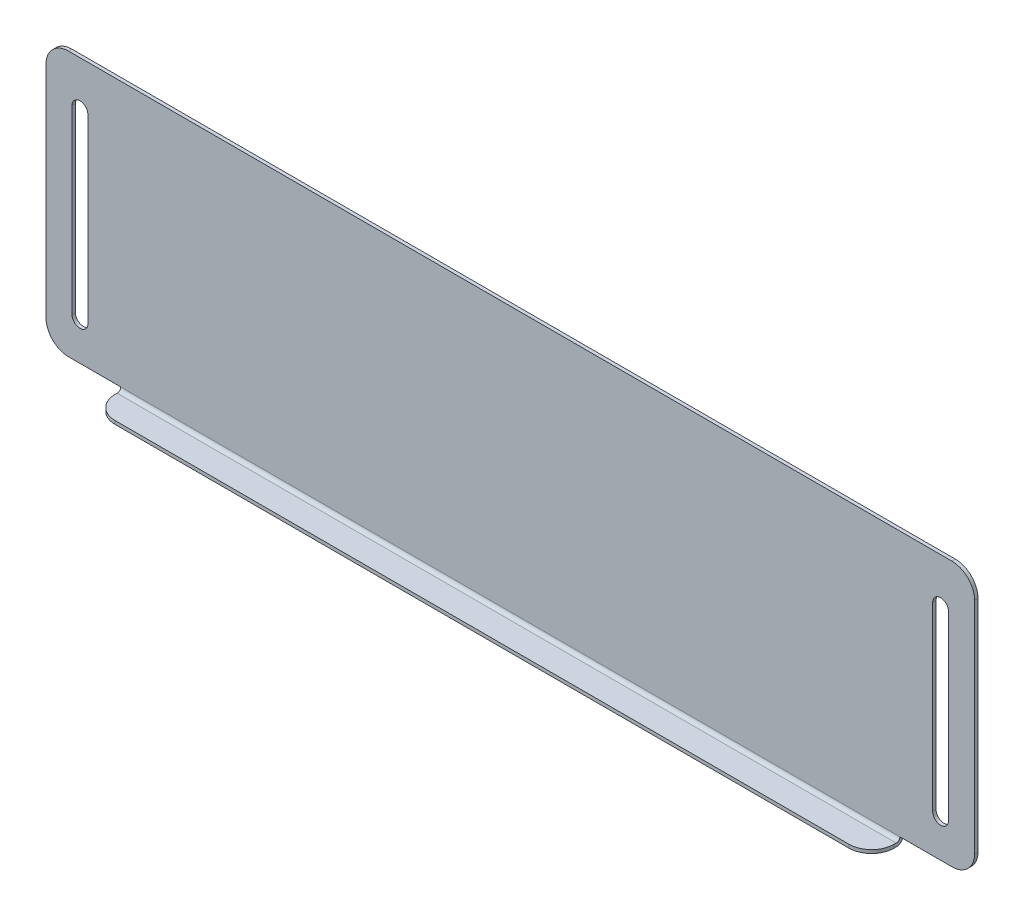
ISO-10303-21;
HEADER;
FILE_DESCRIPTION(('STEP AP214'),'2;1');
FILE_NAME('part.step','',(''),(''),'','','');
FILE_SCHEMA(('AUTOMOTIVE_DESIGN { 1 0 10303 214 1 1 1 1 }'));
ENDSEC;
DATA;
#1=APPLICATION_CONTEXT('core data for automotive mechanical design processes');
#2=APPLICATION_PROTOCOL_DEFINITION('international standard','automotive_design',2000,#1);
#3=PRODUCT_CONTEXT('',#1,'mechanical');
#4=PRODUCT('Part','Part','',(#3));
#5=PRODUCT_RELATED_PRODUCT_CATEGORY('part','',(#4));
#6=PRODUCT_DEFINITION_FORMATION('','',#4);
#7=PRODUCT_DEFINITION_CONTEXT('part definition',#1,'design');
#8=PRODUCT_DEFINITION('design','',#6,#7);
#9=PRODUCT_DEFINITION_SHAPE('','',#8);
#10=(LENGTH_UNIT() NAMED_UNIT(*) SI_UNIT(.MILLI.,.METRE.));
#11=(NAMED_UNIT(*) PLANE_ANGLE_UNIT() SI_UNIT($,.RADIAN.));
#12=(NAMED_UNIT(*) SI_UNIT($,.STERADIAN.) SOLID_ANGLE_UNIT());
#13=UNCERTAINTY_MEASURE_WITH_UNIT(LENGTH_MEASURE(1.E-05),#10,'distance_accuracy_value','');
#14=(GEOMETRIC_REPRESENTATION_CONTEXT(3) GLOBAL_UNCERTAINTY_ASSIGNED_CONTEXT((#13)) GLOBAL_UNIT_ASSIGNED_CONTEXT((#10,
#11,#12)) REPRESENTATION_CONTEXT('',''));
#15=CARTESIAN_POINT('',(0.,0.,0.));
#16=DIRECTION('',(0.,0.,1.));
#17=DIRECTION('',(1.,0.,0.));
#18=AXIS2_PLACEMENT_3D('',#15,#16,#17);
#19=CARTESIAN_POINT('',(-172.,-56.9,-1.50000000000041));
#20=DIRECTION('',(-1.,0.,0.));
#21=DIRECTION('',(0.,0.,1.));
#22=AXIS2_PLACEMENT_3D('',#19,#20,#21);
#23=PLANE('',#22);
#24=DIRECTION('',(0.,0.,-1.));
#25=VECTOR('',#24,1.);
#26=CARTESIAN_POINT('',(-172.,-60.,-1.50000000000043));
#27=LINE('',#26,#25);
#28=CARTESIAN_POINT('',(-172.,-60.,2.5));
#29=VERTEX_POINT('',#28);
#30=CARTESIAN_POINT('',(-172.,-60.,1.59999999999998));
#31=VERTEX_POINT('',#30);
#32=EDGE_CURVE('E304',#29,#31,#27,.T.);
#33=ORIENTED_EDGE('',*,*,#32,.F.);
#34=DIRECTION('',(0.,1.,0.));
#35=VECTOR('',#34,1.);
#36=CARTESIAN_POINT('',(-172.,-58.5,2.50000000000001));
#37=LINE('',#36,#35);
#38=CARTESIAN_POINT('',(-172.,-58.5,2.50000000000001));
#39=VERTEX_POINT('',#38);
#40=EDGE_CURVE('E361',#29,#39,#37,.T.);
#41=ORIENTED_EDGE('',*,*,#40,.T.);
#42=DIRECTION('',(0.,0.,1.));
#43=VECTOR('',#42,1.);
#44=CARTESIAN_POINT('',(-172.,-58.5,-1.99840144432528E-13));
#45=LINE('',#44,#43);
#46=CARTESIAN_POINT('',(-172.,-58.5,1.59999999999998));
#47=VERTEX_POINT('',#46);
#48=EDGE_CURVE('E311',#47,#39,#45,.T.);
#49=ORIENTED_EDGE('',*,*,#48,.F.);
#50=DIRECTION('',(0.,-1.,0.));
#51=VECTOR('',#50,1.);
#52=CARTESIAN_POINT('',(-172.,-58.5,1.59999999999998));
#53=LINE('',#52,#51);
#54=EDGE_CURVE('E351',#47,#31,#53,.T.);
#55=ORIENTED_EDGE('',*,*,#54,.T.);
#56=EDGE_LOOP('',(#33,#41,#49,#55));
#57=FACE_BOUND('',#56,.T.);
#58=ADVANCED_FACE('F62',(#57),#23,.T.);
#59=CARTESIAN_POINT('',(205.,-56.9,1.6));
#60=DIRECTION('',(1.,0.,0.));
#61=DIRECTION('',(0.,-1.,0.));
#62=AXIS2_PLACEMENT_3D('',#59,#60,#61);
#63=CYLINDRICAL_SURFACE('',#62,3.1);
#64=DIRECTION('',(1.,0.,0.));
#65=VECTOR('',#64,1.);
#66=CARTESIAN_POINT('',(205.,-56.9,-1.5));
#67=LINE('',#66,#65);
#68=CARTESIAN_POINT('',(172.,-56.9,-1.50000000000046));
#69=VERTEX_POINT('',#68);
#70=CARTESIAN_POINT('',(-172.,-56.9,-1.50000000000041));
#71=VERTEX_POINT('',#70);
#72=EDGE_CURVE('E337',#69,#71,#67,.F.);
#73=ORIENTED_EDGE('',*,*,#72,.F.);
#74=CARTESIAN_POINT('',(172.,-56.9,1.6));
#75=DIRECTION('',(1.,0.,0.));
#76=DIRECTION('',(0.,0.,-1.));
#77=AXIS2_PLACEMENT_3D('',#74,#75,#76);
#78=CIRCLE('',#77,3.1);
#79=CARTESIAN_POINT('',(172.,-60.,1.59999999999998));
#80=VERTEX_POINT('',#79);
#81=EDGE_CURVE('E301',#69,#80,#78,.F.);
#82=ORIENTED_EDGE('',*,*,#81,.T.);
#83=DIRECTION('',(1.,0.,0.));
#84=VECTOR('',#83,1.);
#85=CARTESIAN_POINT('',(-205.,-60.,1.59999999999999));
#86=LINE('',#85,#84);
#87=EDGE_CURVE('E329',#80,#31,#86,.F.);
#88=ORIENTED_EDGE('',*,*,#87,.T.);
#89=CARTESIAN_POINT('',(-172.,-56.9,1.6));
#90=DIRECTION('',(-1.,0.,0.));
#91=DIRECTION('',(0.,0.,1.));
#92=AXIS2_PLACEMENT_3D('',#89,#90,#91);
#93=CIRCLE('',#92,3.1);
#94=EDGE_CURVE('E318',#31,#71,#93,.F.);
#95=ORIENTED_EDGE('',*,*,#94,.T.);
#96=EDGE_LOOP('',(#73,#82,#88,#95));
#97=FACE_BOUND('',#96,.T.);
#98=ADVANCED_FACE('F481',(#97),#63,.T.);
#99=CARTESIAN_POINT('',(205.,-56.9,1.6));
#100=DIRECTION('',(1.,0.,0.));
#101=DIRECTION('',(0.,-1.,0.));
#102=AXIS2_PLACEMENT_3D('',#99,#100,#101);
#103=CYLINDRICAL_SURFACE('',#102,1.6);
#104=CARTESIAN_POINT('',(172.,-56.9,1.6));
#105=DIRECTION('',(1.,0.,0.));
#106=DIRECTION('',(0.,0.,-1.));
#107=AXIS2_PLACEMENT_3D('',#104,#105,#106);
#108=CIRCLE('',#107,1.6);
#109=CARTESIAN_POINT('',(172.,-56.9,0.));
#110=VERTEX_POINT('',#109);
#111=CARTESIAN_POINT('',(172.,-58.5,1.59999999999998));
#112=VERTEX_POINT('',#111);
#113=EDGE_CURVE('E298',#110,#112,#108,.F.);
#114=ORIENTED_EDGE('',*,*,#113,.F.);
#115=DIRECTION('',(1.,0.,0.));
#116=VECTOR('',#115,1.);
#117=CARTESIAN_POINT('',(205.,-56.9,0.));
#118=LINE('',#117,#116);
#119=CARTESIAN_POINT('',(-172.,-56.9,0.));
#120=VERTEX_POINT('',#119);
#121=EDGE_CURVE('E340',#110,#120,#118,.F.);
#122=ORIENTED_EDGE('',*,*,#121,.T.);
#123=CARTESIAN_POINT('',(-172.,-56.9,1.6));
#124=DIRECTION('',(-1.,0.,0.));
#125=DIRECTION('',(0.,0.,1.));
#126=AXIS2_PLACEMENT_3D('',#123,#124,#125);
#127=CIRCLE('',#126,1.6);
#128=EDGE_CURVE('E315',#47,#120,#127,.F.);
#129=ORIENTED_EDGE('',*,*,#128,.F.);
#130=DIRECTION('',(1.,0.,0.));
#131=VECTOR('',#130,1.);
#132=CARTESIAN_POINT('',(-205.,-58.5,1.6));
#133=LINE('',#132,#131);
#134=EDGE_CURVE('E321',#47,#112,#133,.T.);
#135=ORIENTED_EDGE('',*,*,#134,.T.);
#136=EDGE_LOOP('',(#114,#122,#129,#135));
#137=FACE_BOUND('',#136,.T.);
#138=ADVANCED_FACE('F458',(#137),#103,.F.);
#139=CARTESIAN_POINT('',(0.,-60.,-2.05077366440793E-13));
#140=DIRECTION('',(0.,1.,0.));
#141=DIRECTION('',(0.,0.,1.));
#142=AXIS2_PLACEMENT_3D('',#139,#140,#141);
#143=PLANE('',#142);
#144=DIRECTION('',(-1.,0.,0.));
#145=VECTOR('',#144,1.);
#146=CARTESIAN_POINT('',(0.,-60.,12.5));
#147=LINE('',#146,#145);
#148=CARTESIAN_POINT('',(162.,-60.,12.5));
#149=VERTEX_POINT('',#148);
#150=CARTESIAN_POINT('',(-162.,-60.,12.5));
#151=VERTEX_POINT('',#150);
#152=EDGE_CURVE('E322',#149,#151,#147,.T.);
#153=ORIENTED_EDGE('',*,*,#152,.T.);
#154=CARTESIAN_POINT('',(-162.,-60.,2.5));
#155=DIRECTION('',(0.,1.,0.));
#156=DIRECTION('',(0.,0.,1.));
#157=AXIS2_PLACEMENT_3D('',#154,#155,#156);
#158=CIRCLE('',#157,10.);
#159=EDGE_CURVE('E374',#151,#29,#158,.F.);
#160=ORIENTED_EDGE('',*,*,#159,.T.);
#161=ORIENTED_EDGE('',*,*,#32,.T.);
#162=ORIENTED_EDGE('',*,*,#87,.F.);
#163=DIRECTION('',(0.,0.,1.));
#164=VECTOR('',#163,1.);
#165=CARTESIAN_POINT('',(172.,-60.,-1.50000000000047));
#166=LINE('',#165,#164);
#167=CARTESIAN_POINT('',(172.,-60.,2.5));
#168=VERTEX_POINT('',#167);
#169=EDGE_CURVE('E284',#80,#168,#166,.T.);
#170=ORIENTED_EDGE('',*,*,#169,.T.);
#171=CARTESIAN_POINT('',(162.,-60.,2.5));
#172=DIRECTION('',(0.,1.,0.));
#173=DIRECTION('',(0.,0.,1.));
#174=AXIS2_PLACEMENT_3D('',#171,#172,#173);
#175=CIRCLE('',#174,10.);
#176=EDGE_CURVE('E372',#168,#149,#175,.F.);
#177=ORIENTED_EDGE('',*,*,#176,.T.);
#178=EDGE_LOOP('',(#153,#160,#161,#162,#170,#177));
#179=FACE_BOUND('',#178,.T.);
#180=ADVANCED_FACE('F704',(#179),#143,.F.);
#181=CARTESIAN_POINT('',(0.,-58.5,-1.99840144432528E-13));
#182=DIRECTION('',(0.,1.,0.));
#183=DIRECTION('',(0.,0.,1.));
#184=AXIS2_PLACEMENT_3D('',#181,#182,#183);
#185=PLANE('',#184);
#186=ORIENTED_EDGE('',*,*,#48,.T.);
#187=CARTESIAN_POINT('',(-162.,-58.5,2.50000000000001));
#188=DIRECTION('',(0.,1.,0.));
#189=DIRECTION('',(0.,0.,1.));
#190=AXIS2_PLACEMENT_3D('',#187,#188,#189);
#191=CIRCLE('',#190,10.);
#192=CARTESIAN_POINT('',(-162.,-58.5,12.5));
#193=VERTEX_POINT('',#192);
#194=EDGE_CURVE('E366',#39,#193,#191,.T.);
#195=ORIENTED_EDGE('',*,*,#194,.T.);
#196=DIRECTION('',(1.,0.,0.));
#197=VECTOR('',#196,1.);
#198=CARTESIAN_POINT('',(-205.,-58.5,12.5));
#199=LINE('',#198,#197);
#200=CARTESIAN_POINT('',(162.,-58.5,12.5));
#201=VERTEX_POINT('',#200);
#202=EDGE_CURVE('E326',#201,#193,#199,.F.);
#203=ORIENTED_EDGE('',*,*,#202,.F.);
#204=CARTESIAN_POINT('',(162.,-58.5,2.5));
#205=DIRECTION('',(0.,1.,0.));
#206=DIRECTION('',(0.,0.,1.));
#207=AXIS2_PLACEMENT_3D('',#204,#205,#206);
#208=CIRCLE('',#207,10.);
#209=CARTESIAN_POINT('',(172.,-58.5,2.5));
#210=VERTEX_POINT('',#209);
#211=EDGE_CURVE('E364',#201,#210,#208,.T.);
#212=ORIENTED_EDGE('',*,*,#211,.T.);
#213=DIRECTION('',(0.,0.,-1.));
#214=VECTOR('',#213,1.);
#215=CARTESIAN_POINT('',(172.,-58.5,-1.99840144432528E-13));
#216=LINE('',#215,#214);
#217=EDGE_CURVE('E294',#210,#112,#216,.T.);
#218=ORIENTED_EDGE('',*,*,#217,.T.);
#219=ORIENTED_EDGE('',*,*,#134,.F.);
#220=EDGE_LOOP('',(#186,#195,#203,#212,#218,#219));
#221=FACE_BOUND('',#220,.T.);
#222=ADVANCED_FACE('F712',(#221),#185,.T.);
#223=CARTESIAN_POINT('',(-205.,-60.,12.5));
#224=DIRECTION('',(0.,0.,-1.));
#225=DIRECTION('',(0.,1.,0.));
#226=AXIS2_PLACEMENT_3D('',#223,#224,#225);
#227=PLANE('',#226);
#228=ORIENTED_EDGE('',*,*,#202,.T.);
#229=DIRECTION('',(0.,1.,0.));
#230=VECTOR('',#229,1.);
#231=CARTESIAN_POINT('',(-162.,-60.,12.5));
#232=LINE('',#231,#230);
#233=EDGE_CURVE('E370',#193,#151,#232,.F.);
#234=ORIENTED_EDGE('',*,*,#233,.T.);
#235=ORIENTED_EDGE('',*,*,#152,.F.);
#236=DIRECTION('',(0.,-1.,0.));
#237=VECTOR('',#236,1.);
#238=CARTESIAN_POINT('',(162.,-58.5,12.5));
#239=LINE('',#238,#237);
#240=EDGE_CURVE('E368',#149,#201,#239,.F.);
#241=ORIENTED_EDGE('',*,*,#240,.T.);
#242=EDGE_LOOP('',(#228,#234,#235,#241));
#243=FACE_BOUND('',#242,.T.);
#244=ADVANCED_FACE('F552',(#243),#227,.F.);
#245=CARTESIAN_POINT('',(205.,-60.,-1.5));
#246=DIRECTION('',(1.,0.,0.));
#247=DIRECTION('',(0.,0.,-1.));
#248=AXIS2_PLACEMENT_3D('',#245,#246,#247);
#249=PLANE('',#248);
#250=DIRECTION('',(0.,1.,0.));
#251=VECTOR('',#250,1.);
#252=CARTESIAN_POINT('',(205.,-60.,0.));
#253=LINE('',#252,#251);
#254=CARTESIAN_POINT('',(205.,-46.9,0.));
#255=VERTEX_POINT('',#254);
#256=CARTESIAN_POINT('',(205.,50.,0.));
#257=VERTEX_POINT('',#256);
#258=EDGE_CURVE('E336',#255,#257,#253,.T.);
#259=ORIENTED_EDGE('',*,*,#258,.F.);
#260=DIRECTION('',(0.,0.,-1.));
#261=VECTOR('',#260,1.);
#262=CARTESIAN_POINT('',(205.,-46.9,-1.49999999999997));
#263=LINE('',#262,#261);
#264=CARTESIAN_POINT('',(205.,-46.9,-1.5));
#265=VERTEX_POINT('',#264);
#266=EDGE_CURVE('E405',#255,#265,#263,.T.);
#267=ORIENTED_EDGE('',*,*,#266,.T.);
#268=DIRECTION('',(0.,1.,0.));
#269=VECTOR('',#268,1.);
#270=CARTESIAN_POINT('',(205.,-60.,-1.5));
#271=LINE('',#270,#269);
#272=CARTESIAN_POINT('',(205.,50.,-1.5));
#273=VERTEX_POINT('',#272);
#274=EDGE_CURVE('E341',#265,#273,#271,.T.);
#275=ORIENTED_EDGE('',*,*,#274,.T.);
#276=DIRECTION('',(0.,0.,1.));
#277=VECTOR('',#276,1.);
#278=CARTESIAN_POINT('',(205.,50.,-1.5));
#279=LINE('',#278,#277);
#280=EDGE_CURVE('E402',#273,#257,#279,.T.);
#281=ORIENTED_EDGE('',*,*,#280,.T.);
#282=EDGE_LOOP('',(#259,#267,#275,#281));
#283=FACE_BOUND('',#282,.T.);
#284=ADVANCED_FACE('F427',(#283),#249,.T.);
#285=CARTESIAN_POINT('',(0.,0.,-1.5));
#286=DIRECTION('',(0.,0.,-1.));
#287=DIRECTION('',(-1.,0.,0.));
#288=AXIS2_PLACEMENT_3D('',#285,#286,#287);
#289=PLANE('',#288);
#290=CARTESIAN_POINT('',(190.,40.,-1.5));
#291=DIRECTION('',(0.,0.,1.));
#292=DIRECTION('',(-1.,0.,0.));
#293=AXIS2_PLACEMENT_3D('',#290,#291,#292);
#294=CIRCLE('',#293,3.50000000000006);
#295=CARTESIAN_POINT('',(193.5,40.,-1.5));
#296=VERTEX_POINT('',#295);
#297=CARTESIAN_POINT('',(186.5,40.,-1.5));
#298=VERTEX_POINT('',#297);
#299=EDGE_CURVE('E224',#296,#298,#294,.T.);
#300=ORIENTED_EDGE('',*,*,#299,.T.);
#301=DIRECTION('',(0.,-1.,0.));
#302=VECTOR('',#301,1.);
#303=CARTESIAN_POINT('',(186.5,40.,-1.5));
#304=LINE('',#303,#302);
#305=CARTESIAN_POINT('',(186.5,-40.,-1.5));
#306=VERTEX_POINT('',#305);
#307=EDGE_CURVE('E233',#298,#306,#304,.T.);
#308=ORIENTED_EDGE('',*,*,#307,.T.);
#309=CARTESIAN_POINT('',(190.,-40.,-1.5));
#310=DIRECTION('',(0.,0.,1.));
#311=DIRECTION('',(-1.,0.,0.));
#312=AXIS2_PLACEMENT_3D('',#309,#310,#311);
#313=CIRCLE('',#312,3.50000000000006);
#314=CARTESIAN_POINT('',(193.5,-40.,-1.5));
#315=VERTEX_POINT('',#314);
#316=EDGE_CURVE('E77',#306,#315,#313,.T.);
#317=ORIENTED_EDGE('',*,*,#316,.T.);
#318=DIRECTION('',(0.,1.,0.));
#319=VECTOR('',#318,1.);
#320=CARTESIAN_POINT('',(193.5,40.,-1.5));
#321=LINE('',#320,#319);
#322=EDGE_CURVE('E230',#315,#296,#321,.T.);
#323=ORIENTED_EDGE('',*,*,#322,.T.);
#324=EDGE_LOOP('',(#300,#308,#317,#323));
#325=FACE_BOUND('',#324,.T.);
#326=CARTESIAN_POINT('',(-190.,40.,-1.5));
#327=DIRECTION('',(0.,0.,1.));
#328=DIRECTION('',(1.,0.,0.));
#329=AXIS2_PLACEMENT_3D('',#326,#327,#328);
#330=CIRCLE('',#329,3.50000000000006);
#331=CARTESIAN_POINT('',(-186.5,40.,-1.5));
#332=VERTEX_POINT('',#331);
#333=CARTESIAN_POINT('',(-193.5,40.,-1.5));
#334=VERTEX_POINT('',#333);
#335=EDGE_CURVE('E259',#332,#334,#330,.T.);
#336=ORIENTED_EDGE('',*,*,#335,.T.);
#337=DIRECTION('',(0.,-1.,0.));
#338=VECTOR('',#337,1.);
#339=CARTESIAN_POINT('',(-193.5,40.,-1.5));
#340=LINE('',#339,#338);
#341=CARTESIAN_POINT('',(-193.5,-40.,-1.5));
#342=VERTEX_POINT('',#341);
#343=EDGE_CURVE('E262',#334,#342,#340,.T.);
#344=ORIENTED_EDGE('',*,*,#343,.T.);
#345=CARTESIAN_POINT('',(-190.,-40.,-1.5));
#346=DIRECTION('',(0.,0.,1.));
#347=DIRECTION('',(1.,0.,0.));
#348=AXIS2_PLACEMENT_3D('',#345,#346,#347);
#349=CIRCLE('',#348,3.50000000000006);
#350=CARTESIAN_POINT('',(-186.5,-40.,-1.5));
#351=VERTEX_POINT('',#350);
#352=EDGE_CURVE('E266',#342,#351,#349,.T.);
#353=ORIENTED_EDGE('',*,*,#352,.T.);
#354=DIRECTION('',(0.,1.,0.));
#355=VECTOR('',#354,1.);
#356=CARTESIAN_POINT('',(-186.5,40.,-1.5));
#357=LINE('',#356,#355);
#358=EDGE_CURVE('E269',#351,#332,#357,.T.);
#359=ORIENTED_EDGE('',*,*,#358,.T.);
#360=EDGE_LOOP('',(#336,#344,#353,#359));
#361=FACE_BOUND('',#360,.T.);
#362=DIRECTION('',(-1.,0.,0.));
#363=VECTOR('',#362,1.);
#364=CARTESIAN_POINT('',(-205.,-56.9,-1.5000000000004));
#365=LINE('',#364,#363);
#366=CARTESIAN_POINT('',(-195.,-56.9,-1.50000000000041));
#367=VERTEX_POINT('',#366);
#368=EDGE_CURVE('E308',#71,#367,#365,.T.);
#369=ORIENTED_EDGE('',*,*,#368,.T.);
#370=CARTESIAN_POINT('',(-195.,-46.9,-1.5));
#371=DIRECTION('',(0.,0.,-1.));
#372=DIRECTION('',(-1.,0.,0.));
#373=AXIS2_PLACEMENT_3D('',#370,#371,#372);
#374=CIRCLE('',#373,10.);
#375=CARTESIAN_POINT('',(-205.,-46.9,-1.5));
#376=VERTEX_POINT('',#375);
#377=EDGE_CURVE('E385',#367,#376,#374,.T.);
#378=ORIENTED_EDGE('',*,*,#377,.T.);
#379=DIRECTION('',(0.,-1.,0.));
#380=VECTOR('',#379,1.);
#381=CARTESIAN_POINT('',(-205.,-60.,-1.5));
#382=LINE('',#381,#380);
#383=CARTESIAN_POINT('',(-205.,50.,-1.5));
#384=VERTEX_POINT('',#383);
#385=EDGE_CURVE('E348',#384,#376,#382,.T.);
#386=ORIENTED_EDGE('',*,*,#385,.F.);
#387=CARTESIAN_POINT('',(-195.,50.,-1.5));
#388=DIRECTION('',(0.,0.,-1.));
#389=DIRECTION('',(-1.,0.,0.));
#390=AXIS2_PLACEMENT_3D('',#387,#388,#389);
#391=CIRCLE('',#390,10.);
#392=CARTESIAN_POINT('',(-195.,60.,-1.5));
#393=VERTEX_POINT('',#392);
#394=EDGE_CURVE('E379',#384,#393,#391,.T.);
#395=ORIENTED_EDGE('',*,*,#394,.T.);
#396=DIRECTION('',(-1.,0.,0.));
#397=VECTOR('',#396,1.);
#398=CARTESIAN_POINT('',(-205.,60.,-1.5));
#399=LINE('',#398,#397);
#400=CARTESIAN_POINT('',(195.,60.,-1.5));
#401=VERTEX_POINT('',#400);
#402=EDGE_CURVE('E344',#401,#393,#399,.T.);
#403=ORIENTED_EDGE('',*,*,#402,.F.);
#404=CARTESIAN_POINT('',(195.,50.,-1.5));
#405=DIRECTION('',(0.,0.,-1.));
#406=DIRECTION('',(-1.,0.,0.));
#407=AXIS2_PLACEMENT_3D('',#404,#405,#406);
#408=CIRCLE('',#407,10.);
#409=EDGE_CURVE('E381',#401,#273,#408,.T.);
#410=ORIENTED_EDGE('',*,*,#409,.T.);
#411=ORIENTED_EDGE('',*,*,#274,.F.);
#412=CARTESIAN_POINT('',(195.,-46.9,-1.5));
#413=DIRECTION('',(0.,0.,-1.));
#414=DIRECTION('',(-1.,0.,0.));
#415=AXIS2_PLACEMENT_3D('',#412,#413,#414);
#416=CIRCLE('',#415,10.);
#417=CARTESIAN_POINT('',(195.,-56.9,-1.5));
#418=VERTEX_POINT('',#417);
#419=EDGE_CURVE('E383',#265,#418,#416,.T.);
#420=ORIENTED_EDGE('',*,*,#419,.T.);
#421=EDGE_CURVE('E334',#418,#69,#67,.F.);
#422=ORIENTED_EDGE('',*,*,#421,.T.);
#423=ORIENTED_EDGE('',*,*,#72,.T.);
#424=EDGE_LOOP('',(#369,#378,#386,#395,#403,#410,#411,#420,#422,#423));
#425=FACE_BOUND('',#424,.T.);
#426=ADVANCED_FACE('F237',(#325,#361,#425),#289,.T.);
#427=CARTESIAN_POINT('',(0.,0.,0.));
#428=DIRECTION('',(0.,0.,-1.));
#429=DIRECTION('',(-1.,0.,0.));
#430=AXIS2_PLACEMENT_3D('',#427,#428,#429);
#431=PLANE('',#430);
#432=DIRECTION('',(0.,-1.,0.));
#433=VECTOR('',#432,1.);
#434=CARTESIAN_POINT('',(186.5,40.,0.));
#435=LINE('',#434,#433);
#436=CARTESIAN_POINT('',(186.5,40.,0.));
#437=VERTEX_POINT('',#436);
#438=CARTESIAN_POINT('',(186.5,-40.,0.));
#439=VERTEX_POINT('',#438);
#440=EDGE_CURVE('E249',#437,#439,#435,.T.);
#441=ORIENTED_EDGE('',*,*,#440,.F.);
#442=CARTESIAN_POINT('',(190.,40.,0.));
#443=DIRECTION('',(0.,0.,1.));
#444=DIRECTION('',(-1.,0.,0.));
#445=AXIS2_PLACEMENT_3D('',#442,#443,#444);
#446=CIRCLE('',#445,3.50000000000006);
#447=CARTESIAN_POINT('',(193.5,40.,0.));
#448=VERTEX_POINT('',#447);
#449=EDGE_CURVE('E85',#448,#437,#446,.T.);
#450=ORIENTED_EDGE('',*,*,#449,.F.);
#451=DIRECTION('',(0.,1.,0.));
#452=VECTOR('',#451,1.);
#453=CARTESIAN_POINT('',(193.5,40.,0.));
#454=LINE('',#453,#452);
#455=CARTESIAN_POINT('',(193.5,-40.,0.));
#456=VERTEX_POINT('',#455);
#457=EDGE_CURVE('E240',#456,#448,#454,.T.);
#458=ORIENTED_EDGE('',*,*,#457,.F.);
#459=CARTESIAN_POINT('',(190.,-40.,0.));
#460=DIRECTION('',(0.,0.,1.));
#461=DIRECTION('',(-1.,0.,0.));
#462=AXIS2_PLACEMENT_3D('',#459,#460,#461);
#463=CIRCLE('',#462,3.50000000000006);
#464=EDGE_CURVE('E243',#439,#456,#463,.T.);
#465=ORIENTED_EDGE('',*,*,#464,.F.);
#466=EDGE_LOOP('',(#441,#450,#458,#465));
#467=FACE_BOUND('',#466,.T.);
#468=DIRECTION('',(0.,-1.,0.));
#469=VECTOR('',#468,1.);
#470=CARTESIAN_POINT('',(-193.5,40.,0.));
#471=LINE('',#470,#469);
#472=CARTESIAN_POINT('',(-193.5,40.,0.));
#473=VERTEX_POINT('',#472);
#474=CARTESIAN_POINT('',(-193.5,-40.,0.));
#475=VERTEX_POINT('',#474);
#476=EDGE_CURVE('E274',#473,#475,#471,.T.);
#477=ORIENTED_EDGE('',*,*,#476,.F.);
#478=CARTESIAN_POINT('',(-190.,40.,0.));
#479=DIRECTION('',(0.,0.,1.));
#480=DIRECTION('',(1.,0.,0.));
#481=AXIS2_PLACEMENT_3D('',#478,#479,#480);
#482=CIRCLE('',#481,3.50000000000006);
#483=CARTESIAN_POINT('',(-186.5,40.,0.));
#484=VERTEX_POINT('',#483);
#485=EDGE_CURVE('E255',#484,#473,#482,.T.);
#486=ORIENTED_EDGE('',*,*,#485,.F.);
#487=DIRECTION('',(0.,1.,0.));
#488=VECTOR('',#487,1.);
#489=CARTESIAN_POINT('',(-186.5,40.,0.));
#490=LINE('',#489,#488);
#491=CARTESIAN_POINT('',(-186.5,-40.,0.));
#492=VERTEX_POINT('',#491);
#493=EDGE_CURVE('E263',#492,#484,#490,.T.);
#494=ORIENTED_EDGE('',*,*,#493,.F.);
#495=CARTESIAN_POINT('',(-190.,-40.,0.));
#496=DIRECTION('',(0.,0.,1.));
#497=DIRECTION('',(1.,0.,0.));
#498=AXIS2_PLACEMENT_3D('',#495,#496,#497);
#499=CIRCLE('',#498,3.50000000000006);
#500=EDGE_CURVE('E277',#475,#492,#499,.T.);
#501=ORIENTED_EDGE('',*,*,#500,.F.);
#502=EDGE_LOOP('',(#477,#486,#494,#501));
#503=FACE_BOUND('',#502,.T.);
#504=DIRECTION('',(0.,-1.,0.));
#505=VECTOR('',#504,1.);
#506=CARTESIAN_POINT('',(-205.,-60.,0.));
#507=LINE('',#506,#505);
#508=CARTESIAN_POINT('',(-205.,50.,0.));
#509=VERTEX_POINT('',#508);
#510=CARTESIAN_POINT('',(-205.,-46.9,0.));
#511=VERTEX_POINT('',#510);
#512=EDGE_CURVE('E345',#509,#511,#507,.T.);
#513=ORIENTED_EDGE('',*,*,#512,.T.);
#514=CARTESIAN_POINT('',(-195.,-46.9,0.));
#515=DIRECTION('',(0.,0.,-1.));
#516=DIRECTION('',(-1.,0.,0.));
#517=AXIS2_PLACEMENT_3D('',#514,#515,#516);
#518=CIRCLE('',#517,10.);
#519=CARTESIAN_POINT('',(-195.,-56.9,0.));
#520=VERTEX_POINT('',#519);
#521=EDGE_CURVE('E397',#511,#520,#518,.F.);
#522=ORIENTED_EDGE('',*,*,#521,.T.);
#523=EDGE_CURVE('E325',#120,#520,#118,.F.);
#524=ORIENTED_EDGE('',*,*,#523,.F.);
#525=ORIENTED_EDGE('',*,*,#121,.F.);
#526=CARTESIAN_POINT('',(195.,-56.9,0.));
#527=VERTEX_POINT('',#526);
#528=EDGE_CURVE('E338',#527,#110,#118,.F.);
#529=ORIENTED_EDGE('',*,*,#528,.F.);
#530=CARTESIAN_POINT('',(195.,-46.9,0.));
#531=DIRECTION('',(0.,0.,-1.));
#532=DIRECTION('',(-1.,0.,0.));
#533=AXIS2_PLACEMENT_3D('',#530,#531,#532);
#534=CIRCLE('',#533,10.);
#535=EDGE_CURVE('E395',#527,#255,#534,.F.);
#536=ORIENTED_EDGE('',*,*,#535,.T.);
#537=ORIENTED_EDGE('',*,*,#258,.T.);
#538=CARTESIAN_POINT('',(195.,50.,0.));
#539=DIRECTION('',(0.,0.,-1.));
#540=DIRECTION('',(-1.,0.,0.));
#541=AXIS2_PLACEMENT_3D('',#538,#539,#540);
#542=CIRCLE('',#541,10.);
#543=CARTESIAN_POINT('',(195.,60.,0.));
#544=VERTEX_POINT('',#543);
#545=EDGE_CURVE('E393',#257,#544,#542,.F.);
#546=ORIENTED_EDGE('',*,*,#545,.T.);
#547=DIRECTION('',(-1.,0.,0.));
#548=VECTOR('',#547,1.);
#549=CARTESIAN_POINT('',(-205.,60.,0.));
#550=LINE('',#549,#548);
#551=CARTESIAN_POINT('',(-195.,60.,0.));
#552=VERTEX_POINT('',#551);
#553=EDGE_CURVE('E354',#544,#552,#550,.T.);
#554=ORIENTED_EDGE('',*,*,#553,.T.);
#555=CARTESIAN_POINT('',(-195.,50.,0.));
#556=DIRECTION('',(0.,0.,-1.));
#557=DIRECTION('',(-1.,0.,0.));
#558=AXIS2_PLACEMENT_3D('',#555,#556,#557);
#559=CIRCLE('',#558,10.);
#560=EDGE_CURVE('E391',#552,#509,#559,.F.);
#561=ORIENTED_EDGE('',*,*,#560,.T.);
#562=EDGE_LOOP('',(#513,#522,#524,#525,#529,#536,#537,#546,#554,#561));
#563=FACE_BOUND('',#562,.T.);
#564=ADVANCED_FACE('F419',(#467,#503,#563),#431,.F.);
#565=CARTESIAN_POINT('',(-205.,-60.,-1.5));
#566=DIRECTION('',(-1.,0.,0.));
#567=DIRECTION('',(0.,0.,1.));
#568=AXIS2_PLACEMENT_3D('',#565,#566,#567);
#569=PLANE('',#568);
#570=ORIENTED_EDGE('',*,*,#385,.T.);
#571=DIRECTION('',(0.,0.,-1.));
#572=VECTOR('',#571,1.);
#573=CARTESIAN_POINT('',(-205.,-46.9,0.));
#574=LINE('',#573,#572);
#575=EDGE_CURVE('E389',#376,#511,#574,.F.);
#576=ORIENTED_EDGE('',*,*,#575,.T.);
#577=ORIENTED_EDGE('',*,*,#512,.F.);
#578=DIRECTION('',(0.,0.,1.));
#579=VECTOR('',#578,1.);
#580=CARTESIAN_POINT('',(-205.,50.,-1.5));
#581=LINE('',#580,#579);
#582=EDGE_CURVE('E387',#509,#384,#581,.F.);
#583=ORIENTED_EDGE('',*,*,#582,.T.);
#584=EDGE_LOOP('',(#570,#576,#577,#583));
#585=FACE_BOUND('',#584,.T.);
#586=ADVANCED_FACE('F435',(#585),#569,.T.);
#587=CARTESIAN_POINT('',(-205.,60.,-1.5));
#588=DIRECTION('',(0.,1.,0.));
#589=DIRECTION('',(0.,0.,1.));
#590=AXIS2_PLACEMENT_3D('',#587,#588,#589);
#591=PLANE('',#590);
#592=ORIENTED_EDGE('',*,*,#553,.F.);
#593=DIRECTION('',(0.,0.,1.));
#594=VECTOR('',#593,1.);
#595=CARTESIAN_POINT('',(195.,60.,-1.5));
#596=LINE('',#595,#594);
#597=EDGE_CURVE('E13',#544,#401,#596,.F.);
#598=ORIENTED_EDGE('',*,*,#597,.T.);
#599=ORIENTED_EDGE('',*,*,#402,.T.);
#600=DIRECTION('',(0.,0.,1.));
#601=VECTOR('',#600,1.);
#602=CARTESIAN_POINT('',(-195.,60.,-1.5));
#603=LINE('',#602,#601);
#604=EDGE_CURVE('E70',#393,#552,#603,.T.);
#605=ORIENTED_EDGE('',*,*,#604,.T.);
#606=EDGE_LOOP('',(#592,#598,#599,#605));
#607=FACE_BOUND('',#606,.T.);
#608=ADVANCED_FACE('F413',(#607),#591,.T.);
#609=CARTESIAN_POINT('',(0.,-56.9,-1.97182695703366E-13));
#610=DIRECTION('',(0.,1.,0.));
#611=DIRECTION('',(0.,0.,1.));
#612=AXIS2_PLACEMENT_3D('',#609,#610,#611);
#613=PLANE('',#612);
#614=ORIENTED_EDGE('',*,*,#523,.T.);
#615=DIRECTION('',(0.,0.,-1.));
#616=VECTOR('',#615,1.);
#617=CARTESIAN_POINT('',(-195.,-56.9,-1.5000000000004));
#618=LINE('',#617,#616);
#619=EDGE_CURVE('E376',#520,#367,#618,.T.);
#620=ORIENTED_EDGE('',*,*,#619,.T.);
#621=ORIENTED_EDGE('',*,*,#368,.F.);
#622=DIRECTION('',(0.,0.,-1.));
#623=VECTOR('',#622,1.);
#624=CARTESIAN_POINT('',(-172.,-56.9,-1.50000000000041));
#625=LINE('',#624,#623);
#626=EDGE_CURVE('E305',#120,#71,#625,.T.);
#627=ORIENTED_EDGE('',*,*,#626,.F.);
#628=EDGE_LOOP('',(#614,#620,#621,#627));
#629=FACE_BOUND('',#628,.T.);
#630=ADVANCED_FACE('F445',(#629),#613,.F.);
#631=ORIENTED_EDGE('',*,*,#54,.F.);
#632=ORIENTED_EDGE('',*,*,#128,.T.);
#633=ORIENTED_EDGE('',*,*,#626,.T.);
#634=ORIENTED_EDGE('',*,*,#94,.F.);
#635=EDGE_LOOP('',(#631,#632,#633,#634));
#636=FACE_BOUND('',#635,.T.);
#637=ADVANCED_FACE('F452',(#636),#23,.T.);
#638=CARTESIAN_POINT('',(172.,-56.9,-1.50000000000046));
#639=DIRECTION('',(1.,0.,0.));
#640=DIRECTION('',(0.,0.,-1.));
#641=AXIS2_PLACEMENT_3D('',#638,#639,#640);
#642=PLANE('',#641);
#643=ORIENTED_EDGE('',*,*,#217,.F.);
#644=DIRECTION('',(0.,-1.,0.));
#645=VECTOR('',#644,1.);
#646=CARTESIAN_POINT('',(172.,-60.,2.5));
#647=LINE('',#646,#645);
#648=EDGE_CURVE('E399',#210,#168,#647,.T.);
#649=ORIENTED_EDGE('',*,*,#648,.T.);
#650=ORIENTED_EDGE('',*,*,#169,.F.);
#651=ORIENTED_EDGE('',*,*,#81,.F.);
#652=DIRECTION('',(0.,0.,1.));
#653=VECTOR('',#652,1.);
#654=CARTESIAN_POINT('',(172.,-56.9,-1.50000000000046));
#655=LINE('',#654,#653);
#656=EDGE_CURVE('E291',#69,#110,#655,.T.);
#657=ORIENTED_EDGE('',*,*,#656,.T.);
#658=ORIENTED_EDGE('',*,*,#113,.T.);
#659=EDGE_LOOP('',(#643,#649,#650,#651,#657,#658));
#660=FACE_BOUND('',#659,.T.);
#661=ADVANCED_FACE('F462',(#660),#642,.T.);
#662=CARTESIAN_POINT('',(0.,-56.9,-1.97182695703366E-13));
#663=DIRECTION('',(0.,1.,0.));
#664=DIRECTION('',(0.,0.,1.));
#665=AXIS2_PLACEMENT_3D('',#662,#663,#664);
#666=PLANE('',#665);
#667=ORIENTED_EDGE('',*,*,#421,.F.);
#668=DIRECTION('',(0.,0.,-1.));
#669=VECTOR('',#668,1.);
#670=CARTESIAN_POINT('',(195.,-56.9,0.));
#671=LINE('',#670,#669);
#672=EDGE_CURVE('E408',#418,#527,#671,.F.);
#673=ORIENTED_EDGE('',*,*,#672,.T.);
#674=ORIENTED_EDGE('',*,*,#528,.T.);
#675=ORIENTED_EDGE('',*,*,#656,.F.);
#676=EDGE_LOOP('',(#667,#673,#674,#675));
#677=FACE_BOUND('',#676,.T.);
#678=ADVANCED_FACE('F466',(#677),#666,.F.);
#679=CARTESIAN_POINT('',(-162.,-56.9,2.50000000000001));
#680=DIRECTION('',(0.,-1.,0.));
#681=DIRECTION('',(0.,0.,-1.));
#682=AXIS2_PLACEMENT_3D('',#679,#680,#681);
#683=CYLINDRICAL_SURFACE('',#682,10.);
#684=ORIENTED_EDGE('',*,*,#159,.F.);
#685=ORIENTED_EDGE('',*,*,#233,.F.);
#686=ORIENTED_EDGE('',*,*,#194,.F.);
#687=ORIENTED_EDGE('',*,*,#40,.F.);
#688=EDGE_LOOP('',(#684,#685,#686,#687));
#689=FACE_BOUND('',#688,.T.);
#690=ADVANCED_FACE('F504',(#689),#683,.T.);
#691=CARTESIAN_POINT('',(-195.,-46.9,-1.62488226183831E-13));
#692=DIRECTION('',(0.,0.,1.));
#693=DIRECTION('',(0.,-1.,0.));
#694=AXIS2_PLACEMENT_3D('',#691,#692,#693);
#695=CYLINDRICAL_SURFACE('',#694,10.);
#696=ORIENTED_EDGE('',*,*,#521,.F.);
#697=ORIENTED_EDGE('',*,*,#575,.F.);
#698=ORIENTED_EDGE('',*,*,#377,.F.);
#699=ORIENTED_EDGE('',*,*,#619,.F.);
#700=EDGE_LOOP('',(#696,#697,#698,#699));
#701=FACE_BOUND('',#700,.T.);
#702=ADVANCED_FACE('F442',(#701),#695,.T.);
#703=CARTESIAN_POINT('',(162.,-56.9,2.50000000000001));
#704=DIRECTION('',(0.,1.,0.));
#705=DIRECTION('',(0.,0.,1.));
#706=AXIS2_PLACEMENT_3D('',#703,#704,#705);
#707=CYLINDRICAL_SURFACE('',#706,10.);
#708=ORIENTED_EDGE('',*,*,#211,.F.);
#709=ORIENTED_EDGE('',*,*,#240,.F.);
#710=ORIENTED_EDGE('',*,*,#176,.F.);
#711=ORIENTED_EDGE('',*,*,#648,.F.);
#712=EDGE_LOOP('',(#708,#709,#710,#711));
#713=FACE_BOUND('',#712,.T.);
#714=ADVANCED_FACE('F472',(#713),#707,.T.);
#715=CARTESIAN_POINT('',(195.,-46.9,-1.49999999999995));
#716=DIRECTION('',(0.,0.,1.));
#717=DIRECTION('',(0.,-1.,0.));
#718=AXIS2_PLACEMENT_3D('',#715,#716,#717);
#719=CYLINDRICAL_SURFACE('',#718,10.);
#720=ORIENTED_EDGE('',*,*,#535,.F.);
#721=ORIENTED_EDGE('',*,*,#672,.F.);
#722=ORIENTED_EDGE('',*,*,#419,.F.);
#723=ORIENTED_EDGE('',*,*,#266,.F.);
#724=EDGE_LOOP('',(#720,#721,#722,#723));
#725=FACE_BOUND('',#724,.T.);
#726=ADVANCED_FACE('F470',(#725),#719,.T.);
#727=CARTESIAN_POINT('',(195.,50.,-1.5));
#728=DIRECTION('',(0.,0.,1.));
#729=DIRECTION('',(1.,0.,0.));
#730=AXIS2_PLACEMENT_3D('',#727,#728,#729);
#731=CYLINDRICAL_SURFACE('',#730,10.);
#732=ORIENTED_EDGE('',*,*,#409,.F.);
#733=ORIENTED_EDGE('',*,*,#597,.F.);
#734=ORIENTED_EDGE('',*,*,#545,.F.);
#735=ORIENTED_EDGE('',*,*,#280,.F.);
#736=EDGE_LOOP('',(#732,#733,#734,#735));
#737=FACE_BOUND('',#736,.T.);
#738=ADVANCED_FACE('F425',(#737),#731,.T.);
#739=CARTESIAN_POINT('',(-195.,50.,-1.5));
#740=DIRECTION('',(0.,0.,1.));
#741=DIRECTION('',(1.,0.,0.));
#742=AXIS2_PLACEMENT_3D('',#739,#740,#741);
#743=CYLINDRICAL_SURFACE('',#742,10.);
#744=ORIENTED_EDGE('',*,*,#394,.F.);
#745=ORIENTED_EDGE('',*,*,#582,.F.);
#746=ORIENTED_EDGE('',*,*,#560,.F.);
#747=ORIENTED_EDGE('',*,*,#604,.F.);
#748=EDGE_LOOP('',(#744,#745,#746,#747));
#749=FACE_BOUND('',#748,.T.);
#750=ADVANCED_FACE('F64',(#749),#743,.T.);
#751=CARTESIAN_POINT('',(-190.,40.,-1.5));
#752=DIRECTION('',(0.,0.,1.));
#753=DIRECTION('',(1.,0.,0.));
#754=AXIS2_PLACEMENT_3D('',#751,#752,#753);
#755=CYLINDRICAL_SURFACE('',#754,3.50000000000006);
#756=ORIENTED_EDGE('',*,*,#485,.T.);
#757=DIRECTION('',(0.,0.,1.));
#758=VECTOR('',#757,1.);
#759=CARTESIAN_POINT('',(-193.5,40.,-1.5));
#760=LINE('',#759,#758);
#761=EDGE_CURVE('E272',#334,#473,#760,.T.);
#762=ORIENTED_EDGE('',*,*,#761,.F.);
#763=ORIENTED_EDGE('',*,*,#335,.F.);
#764=DIRECTION('',(0.,0.,1.));
#765=VECTOR('',#764,1.);
#766=CARTESIAN_POINT('',(-186.5,40.,-1.5));
#767=LINE('',#766,#765);
#768=EDGE_CURVE('E282',#332,#484,#767,.T.);
#769=ORIENTED_EDGE('',*,*,#768,.T.);
#770=EDGE_LOOP('',(#756,#762,#763,#769));
#771=FACE_BOUND('',#770,.T.);
#772=ADVANCED_FACE('F505',(#771),#755,.F.);
#773=CARTESIAN_POINT('',(-186.5,40.,-1.5));
#774=DIRECTION('',(1.,0.,0.));
#775=DIRECTION('',(0.,0.,-1.));
#776=AXIS2_PLACEMENT_3D('',#773,#774,#775);
#777=PLANE('',#776);
#778=ORIENTED_EDGE('',*,*,#493,.T.);
#779=ORIENTED_EDGE('',*,*,#768,.F.);
#780=ORIENTED_EDGE('',*,*,#358,.F.);
#781=DIRECTION('',(0.,0.,1.));
#782=VECTOR('',#781,1.);
#783=CARTESIAN_POINT('',(-186.5,-40.,-1.5));
#784=LINE('',#783,#782);
#785=EDGE_CURVE('E285',#351,#492,#784,.T.);
#786=ORIENTED_EDGE('',*,*,#785,.T.);
#787=EDGE_LOOP('',(#778,#779,#780,#786));
#788=FACE_BOUND('',#787,.T.);
#789=ADVANCED_FACE('F508',(#788),#777,.F.);
#790=CARTESIAN_POINT('',(-190.,-40.,-1.5));
#791=DIRECTION('',(0.,0.,1.));
#792=DIRECTION('',(1.,0.,0.));
#793=AXIS2_PLACEMENT_3D('',#790,#791,#792);
#794=CYLINDRICAL_SURFACE('',#793,3.50000000000006);
#795=ORIENTED_EDGE('',*,*,#500,.T.);
#796=ORIENTED_EDGE('',*,*,#785,.F.);
#797=ORIENTED_EDGE('',*,*,#352,.F.);
#798=DIRECTION('',(0.,0.,1.));
#799=VECTOR('',#798,1.);
#800=CARTESIAN_POINT('',(-193.5,-40.,-1.5));
#801=LINE('',#800,#799);
#802=EDGE_CURVE('E287',#342,#475,#801,.T.);
#803=ORIENTED_EDGE('',*,*,#802,.T.);
#804=EDGE_LOOP('',(#795,#796,#797,#803));
#805=FACE_BOUND('',#804,.T.);
#806=ADVANCED_FACE('F513',(#805),#794,.F.);
#807=CARTESIAN_POINT('',(-193.5,40.,-1.5));
#808=DIRECTION('',(-1.,0.,0.));
#809=DIRECTION('',(0.,0.,1.));
#810=AXIS2_PLACEMENT_3D('',#807,#808,#809);
#811=PLANE('',#810);
#812=ORIENTED_EDGE('',*,*,#476,.T.);
#813=ORIENTED_EDGE('',*,*,#802,.F.);
#814=ORIENTED_EDGE('',*,*,#343,.F.);
#815=ORIENTED_EDGE('',*,*,#761,.T.);
#816=EDGE_LOOP('',(#812,#813,#814,#815));
#817=FACE_BOUND('',#816,.T.);
#818=ADVANCED_FACE('F510',(#817),#811,.F.);
#819=CARTESIAN_POINT('',(190.,40.,-1.5));
#820=DIRECTION('',(0.,0.,1.));
#821=DIRECTION('',(1.,0.,0.));
#822=AXIS2_PLACEMENT_3D('',#819,#820,#821);
#823=CYLINDRICAL_SURFACE('',#822,3.50000000000006);
#824=ORIENTED_EDGE('',*,*,#449,.T.);
#825=DIRECTION('',(0.,0.,1.));
#826=VECTOR('',#825,1.);
#827=CARTESIAN_POINT('',(186.5,40.,-1.5));
#828=LINE('',#827,#826);
#829=EDGE_CURVE('E220',#298,#437,#828,.T.);
#830=ORIENTED_EDGE('',*,*,#829,.F.);
#831=ORIENTED_EDGE('',*,*,#299,.F.);
#832=DIRECTION('',(0.,0.,1.));
#833=VECTOR('',#832,1.);
#834=CARTESIAN_POINT('',(193.5,40.,-1.5));
#835=LINE('',#834,#833);
#836=EDGE_CURVE('E253',#296,#448,#835,.T.);
#837=ORIENTED_EDGE('',*,*,#836,.T.);
#838=EDGE_LOOP('',(#824,#830,#831,#837));
#839=FACE_BOUND('',#838,.T.);
#840=ADVANCED_FACE('F222',(#839),#823,.F.);
#841=CARTESIAN_POINT('',(193.5,40.,-1.5));
#842=DIRECTION('',(1.,0.,0.));
#843=DIRECTION('',(0.,0.,-1.));
#844=AXIS2_PLACEMENT_3D('',#841,#842,#843);
#845=PLANE('',#844);
#846=ORIENTED_EDGE('',*,*,#457,.T.);
#847=ORIENTED_EDGE('',*,*,#836,.F.);
#848=ORIENTED_EDGE('',*,*,#322,.F.);
#849=DIRECTION('',(0.,0.,1.));
#850=VECTOR('',#849,1.);
#851=CARTESIAN_POINT('',(193.5,-40.,-1.5));
#852=LINE('',#851,#850);
#853=EDGE_CURVE('E256',#315,#456,#852,.T.);
#854=ORIENTED_EDGE('',*,*,#853,.T.);
#855=EDGE_LOOP('',(#846,#847,#848,#854));
#856=FACE_BOUND('',#855,.T.);
#857=ADVANCED_FACE('F523',(#856),#845,.F.);
#858=CARTESIAN_POINT('',(190.,-40.,-1.5));
#859=DIRECTION('',(0.,0.,1.));
#860=DIRECTION('',(1.,0.,0.));
#861=AXIS2_PLACEMENT_3D('',#858,#859,#860);
#862=CYLINDRICAL_SURFACE('',#861,3.50000000000006);
#863=ORIENTED_EDGE('',*,*,#464,.T.);
#864=ORIENTED_EDGE('',*,*,#853,.F.);
#865=ORIENTED_EDGE('',*,*,#316,.F.);
#866=DIRECTION('',(0.,0.,1.));
#867=VECTOR('',#866,1.);
#868=CARTESIAN_POINT('',(186.5,-40.,-1.5));
#869=LINE('',#868,#867);
#870=EDGE_CURVE('E229',#306,#439,#869,.T.);
#871=ORIENTED_EDGE('',*,*,#870,.T.);
#872=EDGE_LOOP('',(#863,#864,#865,#871));
#873=FACE_BOUND('',#872,.T.);
#874=ADVANCED_FACE('F526',(#873),#862,.F.);
#875=CARTESIAN_POINT('',(186.5,40.,-1.5));
#876=DIRECTION('',(-1.,0.,0.));
#877=DIRECTION('',(0.,0.,1.));
#878=AXIS2_PLACEMENT_3D('',#875,#876,#877);
#879=PLANE('',#878);
#880=ORIENTED_EDGE('',*,*,#440,.T.);
#881=ORIENTED_EDGE('',*,*,#870,.F.);
#882=ORIENTED_EDGE('',*,*,#307,.F.);
#883=ORIENTED_EDGE('',*,*,#829,.T.);
#884=EDGE_LOOP('',(#880,#881,#882,#883));
#885=FACE_BOUND('',#884,.T.);
#886=ADVANCED_FACE('F234',(#885),#879,.F.);
#887=CLOSED_SHELL('',(#58,#98,#138,#180,#222,#244,#284,#426,#564,#586,#608,#630,#637,#661,#678,
#690,#702,#714,#726,#738,#750,#772,#789,#806,#818,#840,#857,#874,#886));
#888=MANIFOLD_SOLID_BREP('B2',#887);
#889=ADVANCED_BREP_SHAPE_REPRESENTATION('',(#18,#888),#14);
#890=SHAPE_DEFINITION_REPRESENTATION(#9,#889);
ENDSEC;
END-ISO-10303-21;
